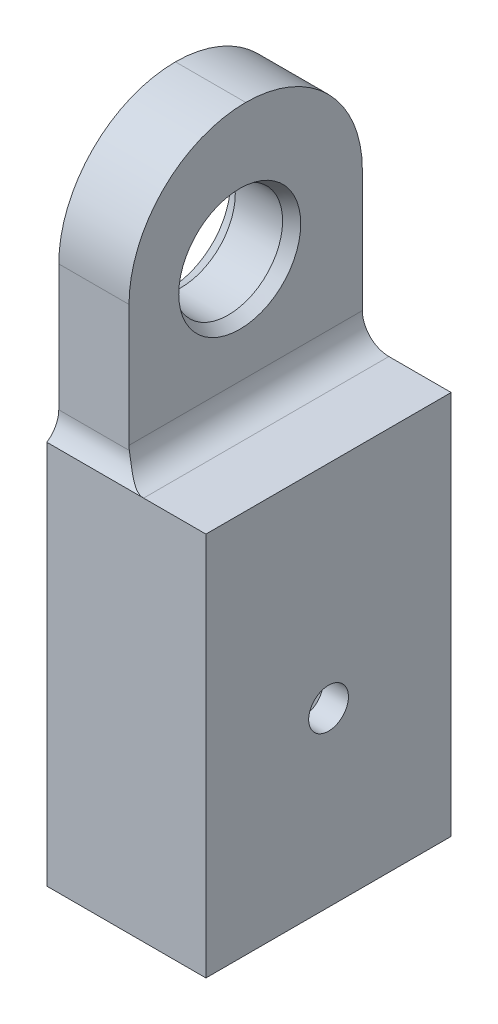
ISO-10303-21;
HEADER;
FILE_DESCRIPTION(('STEP AP214'),'2;1');
FILE_NAME('part.step','',(''),(''),'','','');
FILE_SCHEMA(('AUTOMOTIVE_DESIGN { 1 0 10303 214 1 1 1 1 }'));
ENDSEC;
DATA;
#1=APPLICATION_CONTEXT('core data for automotive mechanical design processes');
#2=APPLICATION_PROTOCOL_DEFINITION('international standard','automotive_design',2000,#1);
#3=PRODUCT_CONTEXT('',#1,'mechanical');
#4=PRODUCT('Part','Part','',(#3));
#5=PRODUCT_RELATED_PRODUCT_CATEGORY('part','',(#4));
#6=PRODUCT_DEFINITION_FORMATION('','',#4);
#7=PRODUCT_DEFINITION_CONTEXT('part definition',#1,'design');
#8=PRODUCT_DEFINITION('design','',#6,#7);
#9=PRODUCT_DEFINITION_SHAPE('','',#8);
#10=(LENGTH_UNIT() NAMED_UNIT(*) SI_UNIT(.MILLI.,.METRE.));
#11=(NAMED_UNIT(*) PLANE_ANGLE_UNIT() SI_UNIT($,.RADIAN.));
#12=(NAMED_UNIT(*) SI_UNIT($,.STERADIAN.) SOLID_ANGLE_UNIT());
#13=UNCERTAINTY_MEASURE_WITH_UNIT(LENGTH_MEASURE(1.E-05),#10,'distance_accuracy_value','');
#14=(GEOMETRIC_REPRESENTATION_CONTEXT(3) GLOBAL_UNCERTAINTY_ASSIGNED_CONTEXT((#13)) GLOBAL_UNIT_ASSIGNED_CONTEXT((#10,
#11,#12)) REPRESENTATION_CONTEXT('',''));
#15=CARTESIAN_POINT('',(0.,0.,0.));
#16=DIRECTION('',(0.,0.,1.));
#17=DIRECTION('',(1.,0.,0.));
#18=AXIS2_PLACEMENT_3D('',#15,#16,#17);
#19=CARTESIAN_POINT('',(0.,29.,0.));
#20=DIRECTION('',(0.,-1.,0.));
#21=DIRECTION('',(0.,0.,-1.));
#22=AXIS2_PLACEMENT_3D('',#19,#20,#21);
#23=PLANE('',#22);
#24=DIRECTION('',(-1.,0.,0.));
#25=VECTOR('',#24,1.);
#26=CARTESIAN_POINT('',(-6.,29.,-9.25));
#27=LINE('',#26,#25);
#28=CARTESIAN_POINT('',(6.,29.,-9.25));
#29=VERTEX_POINT('',#28);
#30=CARTESIAN_POINT('',(1.3,29.,-9.25));
#31=VERTEX_POINT('',#30);
#32=EDGE_CURVE('E189',#29,#31,#27,.T.);
#33=ORIENTED_EDGE('',*,*,#32,.T.);
#34=DIRECTION('',(0.,0.,-1.));
#35=VECTOR('',#34,1.);
#36=CARTESIAN_POINT('',(1.3,29.,8.35));
#37=LINE('',#36,#35);
#38=CARTESIAN_POINT('',(1.3,29.,9.25));
#39=VERTEX_POINT('',#38);
#40=EDGE_CURVE('E253',#31,#39,#37,.F.);
#41=ORIENTED_EDGE('',*,*,#40,.T.);
#42=DIRECTION('',(1.,0.,0.));
#43=VECTOR('',#42,1.);
#44=CARTESIAN_POINT('',(-6.,29.,9.25));
#45=LINE('',#44,#43);
#46=CARTESIAN_POINT('',(6.,29.,9.25));
#47=VERTEX_POINT('',#46);
#48=EDGE_CURVE('E193',#39,#47,#45,.T.);
#49=ORIENTED_EDGE('',*,*,#48,.T.);
#50=DIRECTION('',(0.,0.,-1.));
#51=VECTOR('',#50,1.);
#52=CARTESIAN_POINT('',(6.,29.,9.25));
#53=LINE('',#52,#51);
#54=EDGE_CURVE('E186',#47,#29,#53,.T.);
#55=ORIENTED_EDGE('',*,*,#54,.T.);
#56=EDGE_LOOP('',(#33,#41,#49,#55));
#57=FACE_BOUND('',#56,.T.);
#58=ADVANCED_FACE('F35',(#57),#23,.F.);
#59=CARTESIAN_POINT('',(6.,29.,9.25));
#60=DIRECTION('',(-1.,0.,0.));
#61=DIRECTION('',(0.,0.,1.));
#62=AXIS2_PLACEMENT_3D('',#59,#60,#61);
#63=PLANE('',#62);
#64=CARTESIAN_POINT('',(6.,13.,0.));
#65=DIRECTION('',(1.,0.,0.));
#66=DIRECTION('',(0.,0.,-1.));
#67=AXIS2_PLACEMENT_3D('',#64,#65,#66);
#68=CIRCLE('',#67,1.5);
#69=CARTESIAN_POINT('',(6.,13.,-1.5));
#70=VERTEX_POINT('',#69);
#71=EDGE_CURVE('E361',#70,#70,#68,.T.);
#72=ORIENTED_EDGE('',*,*,#71,.F.);
#73=EDGE_LOOP('',(#72));
#74=FACE_BOUND('',#73,.T.);
#75=DIRECTION('',(0.,0.,-1.));
#76=VECTOR('',#75,1.);
#77=CARTESIAN_POINT('',(6.,0.,9.25));
#78=LINE('',#77,#76);
#79=CARTESIAN_POINT('',(6.,0.,9.25));
#80=VERTEX_POINT('',#79);
#81=CARTESIAN_POINT('',(6.,0.,-9.25));
#82=VERTEX_POINT('',#81);
#83=EDGE_CURVE('E182',#80,#82,#78,.T.);
#84=ORIENTED_EDGE('',*,*,#83,.T.);
#85=DIRECTION('',(0.,-1.,0.));
#86=VECTOR('',#85,1.);
#87=CARTESIAN_POINT('',(6.,29.,-9.25));
#88=LINE('',#87,#86);
#89=EDGE_CURVE('E213',#29,#82,#88,.T.);
#90=ORIENTED_EDGE('',*,*,#89,.F.);
#91=ORIENTED_EDGE('',*,*,#54,.F.);
#92=DIRECTION('',(0.,-1.,0.));
#93=VECTOR('',#92,1.);
#94=CARTESIAN_POINT('',(6.,29.,9.25));
#95=LINE('',#94,#93);
#96=EDGE_CURVE('E197',#47,#80,#95,.T.);
#97=ORIENTED_EDGE('',*,*,#96,.T.);
#98=EDGE_LOOP('',(#84,#90,#91,#97));
#99=FACE_BOUND('',#98,.T.);
#100=ADVANCED_FACE('F297',(#74,#99),#63,.F.);
#101=CARTESIAN_POINT('',(-6.,29.,-9.25));
#102=DIRECTION('',(0.,0.,1.));
#103=DIRECTION('',(1.,0.,0.));
#104=AXIS2_PLACEMENT_3D('',#101,#102,#103);
#105=PLANE('',#104);
#106=DIRECTION('',(0.,-1.,0.));
#107=VECTOR('',#106,1.);
#108=CARTESIAN_POINT('',(-6.,29.,-9.25));
#109=LINE('',#108,#107);
#110=CARTESIAN_POINT('',(-6.,40.2,-9.25));
#111=VERTEX_POINT('',#110);
#112=CARTESIAN_POINT('',(-6.,0.,-9.25));
#113=VERTEX_POINT('',#112);
#114=EDGE_CURVE('E211',#111,#113,#109,.T.);
#115=ORIENTED_EDGE('',*,*,#114,.F.);
#116=DIRECTION('',(-1.,0.,0.));
#117=VECTOR('',#116,1.);
#118=CARTESIAN_POINT('',(-6.,40.2,-9.25));
#119=LINE('',#118,#117);
#120=CARTESIAN_POINT('',(-0.699999999999998,40.2,-9.25));
#121=VERTEX_POINT('',#120);
#122=EDGE_CURVE('E220',#111,#121,#119,.F.);
#123=ORIENTED_EDGE('',*,*,#122,.T.);
#124=DIRECTION('',(0.,-1.,0.));
#125=VECTOR('',#124,1.);
#126=CARTESIAN_POINT('',(-0.699999999999998,49.,-9.25));
#127=LINE('',#126,#125);
#128=CARTESIAN_POINT('',(-0.699999999999998,31.,-9.25));
#129=VERTEX_POINT('',#128);
#130=EDGE_CURVE('E170',#121,#129,#127,.T.);
#131=ORIENTED_EDGE('',*,*,#130,.T.);
#132=CARTESIAN_POINT('',(1.3,31.,-9.25));
#133=DIRECTION('',(0.,0.,1.));
#134=DIRECTION('',(1.,0.,0.));
#135=AXIS2_PLACEMENT_3D('',#132,#133,#134);
#136=CIRCLE('',#135,2.);
#137=EDGE_CURVE('E257',#129,#31,#136,.T.);
#138=ORIENTED_EDGE('',*,*,#137,.T.);
#139=ORIENTED_EDGE('',*,*,#32,.F.);
#140=ORIENTED_EDGE('',*,*,#89,.T.);
#141=DIRECTION('',(-1.,0.,0.));
#142=VECTOR('',#141,1.);
#143=CARTESIAN_POINT('',(-6.,0.,-9.25));
#144=LINE('',#143,#142);
#145=EDGE_CURVE('E200',#82,#113,#144,.T.);
#146=ORIENTED_EDGE('',*,*,#145,.T.);
#147=EDGE_LOOP('',(#115,#123,#131,#138,#139,#140,#146));
#148=FACE_BOUND('',#147,.T.);
#149=ADVANCED_FACE('F309',(#148),#105,.F.);
#150=CARTESIAN_POINT('',(-6.,29.,9.25));
#151=DIRECTION('',(1.,0.,0.));
#152=DIRECTION('',(0.,0.,-1.));
#153=AXIS2_PLACEMENT_3D('',#150,#151,#152);
#154=PLANE('',#153);
#155=CARTESIAN_POINT('',(-6.,39.,0.));
#156=DIRECTION('',(1.,0.,0.));
#157=DIRECTION('',(0.,0.,-1.));
#158=AXIS2_PLACEMENT_3D('',#155,#156,#157);
#159=CIRCLE('',#158,4.60000000000004);
#160=CARTESIAN_POINT('',(-6.,39.,-4.60000000000004));
#161=VERTEX_POINT('',#160);
#162=EDGE_CURVE('E244',#161,#161,#159,.T.);
#163=ORIENTED_EDGE('',*,*,#162,.T.);
#164=EDGE_LOOP('',(#163));
#165=FACE_BOUND('',#164,.T.);
#166=CARTESIAN_POINT('',(-6.,13.,0.));
#167=DIRECTION('',(1.,0.,0.));
#168=DIRECTION('',(0.,0.,-1.));
#169=AXIS2_PLACEMENT_3D('',#166,#167,#168);
#170=CIRCLE('',#169,1.5);
#171=CARTESIAN_POINT('',(-6.,13.,-1.5));
#172=VERTEX_POINT('',#171);
#173=EDGE_CURVE('E238',#172,#172,#170,.T.);
#174=ORIENTED_EDGE('',*,*,#173,.T.);
#175=EDGE_LOOP('',(#174));
#176=FACE_BOUND('',#175,.T.);
#177=CARTESIAN_POINT('',(-6.,40.2,-0.449999999999999));
#178=DIRECTION('',(1.,0.,0.));
#179=DIRECTION('',(0.,0.,-1.));
#180=AXIS2_PLACEMENT_3D('',#177,#178,#179);
#181=CIRCLE('',#180,8.8);
#182=CARTESIAN_POINT('',(-6.,40.2,8.35));
#183=VERTEX_POINT('',#182);
#184=CARTESIAN_POINT('',(-6.,49.,-0.449999999999999));
#185=VERTEX_POINT('',#184);
#186=EDGE_CURVE('E216',#183,#185,#181,.F.);
#187=ORIENTED_EDGE('',*,*,#186,.T.);
#188=CARTESIAN_POINT('',(-6.,40.2,-0.450000000000001));
#189=DIRECTION('',(1.,0.,0.));
#190=DIRECTION('',(0.,0.,-1.));
#191=AXIS2_PLACEMENT_3D('',#188,#189,#190);
#192=CIRCLE('',#191,8.8);
#193=EDGE_CURVE('E218',#185,#111,#192,.F.);
#194=ORIENTED_EDGE('',*,*,#193,.T.);
#195=ORIENTED_EDGE('',*,*,#114,.T.);
#196=DIRECTION('',(0.,0.,1.));
#197=VECTOR('',#196,1.);
#198=CARTESIAN_POINT('',(-6.,0.,9.25));
#199=LINE('',#198,#197);
#200=CARTESIAN_POINT('',(-6.,0.,9.25));
#201=VERTEX_POINT('',#200);
#202=EDGE_CURVE('E203',#113,#201,#199,.T.);
#203=ORIENTED_EDGE('',*,*,#202,.T.);
#204=DIRECTION('',(0.,-1.,0.));
#205=VECTOR('',#204,1.);
#206=CARTESIAN_POINT('',(-6.,29.,9.25));
#207=LINE('',#206,#205);
#208=CARTESIAN_POINT('',(-6.,29.,9.25));
#209=VERTEX_POINT('',#208);
#210=EDGE_CURVE('E208',#209,#201,#207,.T.);
#211=ORIENTED_EDGE('',*,*,#210,.F.);
#212=CARTESIAN_POINT('',(-6.,30.670329308849,10.35));
#213=DIRECTION('',(1.,0.,0.));
#214=DIRECTION('',(0.,0.,-1.));
#215=AXIS2_PLACEMENT_3D('',#212,#213,#214);
#216=CIRCLE('',#215,2.);
#217=CARTESIAN_POINT('',(-6.,30.670329308849,8.35));
#218=VERTEX_POINT('',#217);
#219=EDGE_CURVE('E11',#209,#218,#216,.T.);
#220=ORIENTED_EDGE('',*,*,#219,.T.);
#221=DIRECTION('',(0.,-1.,0.));
#222=VECTOR('',#221,1.);
#223=CARTESIAN_POINT('',(-6.,49.,8.35));
#224=LINE('',#223,#222);
#225=EDGE_CURVE('E351',#183,#218,#224,.T.);
#226=ORIENTED_EDGE('',*,*,#225,.F.);
#227=EDGE_LOOP('',(#187,#194,#195,#203,#211,#220,#226));
#228=FACE_BOUND('',#227,.T.);
#229=ADVANCED_FACE('F305',(#165,#176,#228),#154,.F.);
#230=CARTESIAN_POINT('',(-6.,29.,9.25));
#231=DIRECTION('',(0.,0.,-1.));
#232=DIRECTION('',(-1.,0.,0.));
#233=AXIS2_PLACEMENT_3D('',#230,#231,#232);
#234=PLANE('',#233);
#235=DIRECTION('',(1.,0.,0.));
#236=VECTOR('',#235,1.);
#237=CARTESIAN_POINT('',(-6.,0.,9.25));
#238=LINE('',#237,#236);
#239=EDGE_CURVE('E190',#201,#80,#238,.T.);
#240=ORIENTED_EDGE('',*,*,#239,.T.);
#241=ORIENTED_EDGE('',*,*,#96,.F.);
#242=ORIENTED_EDGE('',*,*,#48,.F.);
#243=EDGE_CURVE('E194',#209,#39,#45,.T.);
#244=ORIENTED_EDGE('',*,*,#243,.F.);
#245=ORIENTED_EDGE('',*,*,#210,.T.);
#246=EDGE_LOOP('',(#240,#241,#242,#244,#245));
#247=FACE_BOUND('',#246,.T.);
#248=ADVANCED_FACE('F301',(#247),#234,.F.);
#249=CARTESIAN_POINT('',(0.,0.,0.));
#250=DIRECTION('',(0.,-1.,0.));
#251=DIRECTION('',(0.,0.,-1.));
#252=AXIS2_PLACEMENT_3D('',#249,#250,#251);
#253=PLANE('',#252);
#254=DIRECTION('',(0.,0.,1.));
#255=VECTOR('',#254,1.);
#256=CARTESIAN_POINT('',(4.1,0.,-7.6));
#257=LINE('',#256,#255);
#258=CARTESIAN_POINT('',(4.1,0.,-7.6));
#259=VERTEX_POINT('',#258);
#260=CARTESIAN_POINT('',(4.1,0.,7.6));
#261=VERTEX_POINT('',#260);
#262=EDGE_CURVE('E147',#259,#261,#257,.T.);
#263=ORIENTED_EDGE('',*,*,#262,.F.);
#264=DIRECTION('',(1.,0.,0.));
#265=VECTOR('',#264,1.);
#266=CARTESIAN_POINT('',(-4.1,0.,-7.6));
#267=LINE('',#266,#265);
#268=CARTESIAN_POINT('',(-4.1,0.,-7.6));
#269=VERTEX_POINT('',#268);
#270=EDGE_CURVE('E164',#269,#259,#267,.T.);
#271=ORIENTED_EDGE('',*,*,#270,.F.);
#272=DIRECTION('',(0.,0.,-1.));
#273=VECTOR('',#272,1.);
#274=CARTESIAN_POINT('',(-4.1,0.,-7.6));
#275=LINE('',#274,#273);
#276=CARTESIAN_POINT('',(-4.1,0.,7.6));
#277=VERTEX_POINT('',#276);
#278=EDGE_CURVE('E167',#277,#269,#275,.T.);
#279=ORIENTED_EDGE('',*,*,#278,.F.);
#280=DIRECTION('',(-1.,0.,0.));
#281=VECTOR('',#280,1.);
#282=CARTESIAN_POINT('',(-4.1,0.,7.6));
#283=LINE('',#282,#281);
#284=EDGE_CURVE('E176',#261,#277,#283,.T.);
#285=ORIENTED_EDGE('',*,*,#284,.F.);
#286=EDGE_LOOP('',(#263,#271,#279,#285));
#287=FACE_BOUND('',#286,.T.);
#288=ORIENTED_EDGE('',*,*,#83,.F.);
#289=ORIENTED_EDGE('',*,*,#239,.F.);
#290=ORIENTED_EDGE('',*,*,#202,.F.);
#291=ORIENTED_EDGE('',*,*,#145,.F.);
#292=EDGE_LOOP('',(#288,#289,#290,#291));
#293=FACE_BOUND('',#292,.T.);
#294=ADVANCED_FACE('F293',(#287,#293),#253,.T.);
#295=CARTESIAN_POINT('',(4.1,23.,-7.6));
#296=DIRECTION('',(1.,0.,0.));
#297=DIRECTION('',(0.,0.,-1.));
#298=AXIS2_PLACEMENT_3D('',#295,#296,#297);
#299=PLANE('',#298);
#300=CARTESIAN_POINT('',(4.1,13.,0.));
#301=DIRECTION('',(1.,0.,0.));
#302=DIRECTION('',(0.,0.,-1.));
#303=AXIS2_PLACEMENT_3D('',#300,#301,#302);
#304=CIRCLE('',#303,1.5);
#305=CARTESIAN_POINT('',(4.1,13.,-1.5));
#306=VERTEX_POINT('',#305);
#307=EDGE_CURVE('E234',#306,#306,#304,.T.);
#308=ORIENTED_EDGE('',*,*,#307,.T.);
#309=EDGE_LOOP('',(#308));
#310=FACE_BOUND('',#309,.T.);
#311=ORIENTED_EDGE('',*,*,#262,.T.);
#312=DIRECTION('',(0.,-1.,0.));
#313=VECTOR('',#312,1.);
#314=CARTESIAN_POINT('',(4.1,23.,7.6));
#315=LINE('',#314,#313);
#316=CARTESIAN_POINT('',(4.1,23.,7.6));
#317=VERTEX_POINT('',#316);
#318=EDGE_CURVE('E140',#317,#261,#315,.T.);
#319=ORIENTED_EDGE('',*,*,#318,.F.);
#320=DIRECTION('',(0.,0.,1.));
#321=VECTOR('',#320,1.);
#322=CARTESIAN_POINT('',(4.1,23.,-7.6));
#323=LINE('',#322,#321);
#324=CARTESIAN_POINT('',(4.1,23.,-7.6));
#325=VERTEX_POINT('',#324);
#326=EDGE_CURVE('E144',#325,#317,#323,.T.);
#327=ORIENTED_EDGE('',*,*,#326,.F.);
#328=DIRECTION('',(0.,-1.,0.));
#329=VECTOR('',#328,1.);
#330=CARTESIAN_POINT('',(4.1,23.,-7.6));
#331=LINE('',#330,#329);
#332=EDGE_CURVE('E180',#325,#259,#331,.T.);
#333=ORIENTED_EDGE('',*,*,#332,.T.);
#334=EDGE_LOOP('',(#311,#319,#327,#333));
#335=FACE_BOUND('',#334,.T.);
#336=ADVANCED_FACE('F142',(#310,#335),#299,.F.);
#337=CARTESIAN_POINT('',(-4.1,23.,-7.6));
#338=DIRECTION('',(0.,0.,-1.));
#339=DIRECTION('',(-1.,0.,0.));
#340=AXIS2_PLACEMENT_3D('',#337,#338,#339);
#341=PLANE('',#340);
#342=ORIENTED_EDGE('',*,*,#270,.T.);
#343=ORIENTED_EDGE('',*,*,#332,.F.);
#344=DIRECTION('',(1.,0.,0.));
#345=VECTOR('',#344,1.);
#346=CARTESIAN_POINT('',(-4.1,23.,-7.6));
#347=LINE('',#346,#345);
#348=CARTESIAN_POINT('',(-4.1,23.,-7.6));
#349=VERTEX_POINT('',#348);
#350=EDGE_CURVE('E152',#349,#325,#347,.T.);
#351=ORIENTED_EDGE('',*,*,#350,.F.);
#352=DIRECTION('',(0.,-1.,0.));
#353=VECTOR('',#352,1.);
#354=CARTESIAN_POINT('',(-4.1,23.,-7.6));
#355=LINE('',#354,#353);
#356=EDGE_CURVE('E183',#349,#269,#355,.T.);
#357=ORIENTED_EDGE('',*,*,#356,.T.);
#358=EDGE_LOOP('',(#342,#343,#351,#357));
#359=FACE_BOUND('',#358,.T.);
#360=ADVANCED_FACE('F281',(#359),#341,.F.);
#361=CARTESIAN_POINT('',(-4.1,23.,-7.6));
#362=DIRECTION('',(-1.,0.,0.));
#363=DIRECTION('',(0.,0.,1.));
#364=AXIS2_PLACEMENT_3D('',#361,#362,#363);
#365=PLANE('',#364);
#366=CARTESIAN_POINT('',(-4.1,13.,0.));
#367=DIRECTION('',(-1.,0.,0.));
#368=DIRECTION('',(0.,0.,1.));
#369=AXIS2_PLACEMENT_3D('',#366,#367,#368);
#370=CIRCLE('',#369,1.5);
#371=CARTESIAN_POINT('',(-4.1,13.,1.5));
#372=VERTEX_POINT('',#371);
#373=EDGE_CURVE('E235',#372,#372,#370,.T.);
#374=ORIENTED_EDGE('',*,*,#373,.T.);
#375=EDGE_LOOP('',(#374));
#376=FACE_BOUND('',#375,.T.);
#377=ORIENTED_EDGE('',*,*,#278,.T.);
#378=ORIENTED_EDGE('',*,*,#356,.F.);
#379=DIRECTION('',(0.,0.,-1.));
#380=VECTOR('',#379,1.);
#381=CARTESIAN_POINT('',(-4.1,23.,-7.6));
#382=LINE('',#381,#380);
#383=CARTESIAN_POINT('',(-4.1,23.,7.6));
#384=VERTEX_POINT('',#383);
#385=EDGE_CURVE('E160',#384,#349,#382,.T.);
#386=ORIENTED_EDGE('',*,*,#385,.F.);
#387=DIRECTION('',(0.,-1.,0.));
#388=VECTOR('',#387,1.);
#389=CARTESIAN_POINT('',(-4.1,23.,7.6));
#390=LINE('',#389,#388);
#391=EDGE_CURVE('E151',#384,#277,#390,.T.);
#392=ORIENTED_EDGE('',*,*,#391,.T.);
#393=EDGE_LOOP('',(#377,#378,#386,#392));
#394=FACE_BOUND('',#393,.T.);
#395=ADVANCED_FACE('F284',(#376,#394),#365,.F.);
#396=CARTESIAN_POINT('',(-4.1,23.,7.6));
#397=DIRECTION('',(0.,0.,1.));
#398=DIRECTION('',(1.,0.,0.));
#399=AXIS2_PLACEMENT_3D('',#396,#397,#398);
#400=PLANE('',#399);
#401=ORIENTED_EDGE('',*,*,#284,.T.);
#402=ORIENTED_EDGE('',*,*,#391,.F.);
#403=DIRECTION('',(-1.,0.,0.));
#404=VECTOR('',#403,1.);
#405=CARTESIAN_POINT('',(-4.1,23.,7.6));
#406=LINE('',#405,#404);
#407=EDGE_CURVE('E155',#317,#384,#406,.T.);
#408=ORIENTED_EDGE('',*,*,#407,.F.);
#409=ORIENTED_EDGE('',*,*,#318,.T.);
#410=EDGE_LOOP('',(#401,#402,#408,#409));
#411=FACE_BOUND('',#410,.T.);
#412=ADVANCED_FACE('F156',(#411),#400,.F.);
#413=CARTESIAN_POINT('',(0.,23.,0.));
#414=DIRECTION('',(0.,1.,0.));
#415=DIRECTION('',(0.,0.,1.));
#416=AXIS2_PLACEMENT_3D('',#413,#414,#415);
#417=PLANE('',#416);
#418=ORIENTED_EDGE('',*,*,#326,.T.);
#419=ORIENTED_EDGE('',*,*,#407,.T.);
#420=ORIENTED_EDGE('',*,*,#385,.T.);
#421=ORIENTED_EDGE('',*,*,#350,.T.);
#422=EDGE_LOOP('',(#418,#419,#420,#421));
#423=FACE_BOUND('',#422,.T.);
#424=ADVANCED_FACE('F162',(#423),#417,.F.);
#425=CARTESIAN_POINT('',(-0.699999999999998,49.,8.35));
#426=DIRECTION('',(-1.,0.,0.));
#427=DIRECTION('',(0.,0.,1.));
#428=AXIS2_PLACEMENT_3D('',#425,#426,#427);
#429=PLANE('',#428);
#430=CARTESIAN_POINT('',(-0.699999999999998,39.,0.));
#431=DIRECTION('',(-1.,0.,0.));
#432=DIRECTION('',(0.,0.,1.));
#433=AXIS2_PLACEMENT_3D('',#430,#431,#432);
#434=CIRCLE('',#433,4.60000000000005);
#435=CARTESIAN_POINT('',(-0.699999999999998,39.,4.60000000000005));
#436=VERTEX_POINT('',#435);
#437=EDGE_CURVE('E247',#436,#436,#434,.T.);
#438=ORIENTED_EDGE('',*,*,#437,.T.);
#439=EDGE_LOOP('',(#438));
#440=FACE_BOUND('',#439,.T.);
#441=DIRECTION('',(0.,-1.,0.));
#442=VECTOR('',#441,1.);
#443=CARTESIAN_POINT('',(-0.699999999999998,49.,8.35));
#444=LINE('',#443,#442);
#445=CARTESIAN_POINT('',(-0.699999999999998,40.2,8.35));
#446=VERTEX_POINT('',#445);
#447=CARTESIAN_POINT('',(-0.699999999999998,31.,8.35));
#448=VERTEX_POINT('',#447);
#449=EDGE_CURVE('E233',#446,#448,#444,.T.);
#450=ORIENTED_EDGE('',*,*,#449,.T.);
#451=DIRECTION('',(0.,0.,-1.));
#452=VECTOR('',#451,1.);
#453=CARTESIAN_POINT('',(-0.699999999999998,31.,-9.25));
#454=LINE('',#453,#452);
#455=EDGE_CURVE('E250',#448,#129,#454,.T.);
#456=ORIENTED_EDGE('',*,*,#455,.T.);
#457=ORIENTED_EDGE('',*,*,#130,.F.);
#458=CARTESIAN_POINT('',(-0.699999999999998,40.2,-0.450000000000001));
#459=DIRECTION('',(-1.,0.,0.));
#460=DIRECTION('',(0.,0.,1.));
#461=AXIS2_PLACEMENT_3D('',#458,#459,#460);
#462=CIRCLE('',#461,8.8);
#463=CARTESIAN_POINT('',(-0.699999999999998,49.,-0.449999999999999));
#464=VERTEX_POINT('',#463);
#465=EDGE_CURVE('E225',#121,#464,#462,.F.);
#466=ORIENTED_EDGE('',*,*,#465,.T.);
#467=CARTESIAN_POINT('',(-0.699999999999998,40.2,-0.449999999999999));
#468=DIRECTION('',(-1.,0.,0.));
#469=DIRECTION('',(0.,0.,1.));
#470=AXIS2_PLACEMENT_3D('',#467,#468,#469);
#471=CIRCLE('',#470,8.8);
#472=EDGE_CURVE('E223',#464,#446,#471,.F.);
#473=ORIENTED_EDGE('',*,*,#472,.T.);
#474=EDGE_LOOP('',(#450,#456,#457,#466,#473));
#475=FACE_BOUND('',#474,.T.);
#476=ADVANCED_FACE('F274',(#440,#475),#429,.F.);
#477=CARTESIAN_POINT('',(-6.,49.,8.35));
#478=DIRECTION('',(0.,0.,-1.));
#479=DIRECTION('',(-1.,0.,0.));
#480=AXIS2_PLACEMENT_3D('',#477,#478,#479);
#481=PLANE('',#480);
#482=ORIENTED_EDGE('',*,*,#225,.T.);
#483=DIRECTION('',(1.,0.,0.));
#484=VECTOR('',#483,1.);
#485=CARTESIAN_POINT('',(-6.,30.670329308849,8.35));
#486=LINE('',#485,#484);
#487=CARTESIAN_POINT('',(-0.699999999999998,30.670329308849,8.35));
#488=VERTEX_POINT('',#487);
#489=EDGE_CURVE('E255',#218,#488,#486,.T.);
#490=ORIENTED_EDGE('',*,*,#489,.T.);
#491=CARTESIAN_POINT('',(-0.699999999999998,30.670329308849,8.35));
#492=CARTESIAN_POINT('',(-0.672642196495861,30.670329308849,8.35));
#493=B_SPLINE_CURVE_WITH_KNOTS('',1,(#491,#492),.UNSPECIFIED.,.F.,.F.,(2,2),(0.,1.),.UNSPECIFIED.);
#494=CARTESIAN_POINT('',(-0.672642196495861,30.670329308849,8.35));
#495=VERTEX_POINT('',#494);
#496=EDGE_CURVE('E49',#488,#495,#493,.T.);
#497=ORIENTED_EDGE('',*,*,#496,.T.);
#498=CARTESIAN_POINT('',(1.3,31.,8.35));
#499=DIRECTION('',(0.,0.,-1.));
#500=DIRECTION('',(-1.,0.,0.));
#501=AXIS2_PLACEMENT_3D('',#498,#499,#500);
#502=CIRCLE('',#501,2.);
#503=EDGE_CURVE('E259',#495,#448,#502,.T.);
#504=ORIENTED_EDGE('',*,*,#503,.T.);
#505=ORIENTED_EDGE('',*,*,#449,.F.);
#506=DIRECTION('',(1.,0.,0.));
#507=VECTOR('',#506,1.);
#508=CARTESIAN_POINT('',(-6.,40.2,8.35));
#509=LINE('',#508,#507);
#510=EDGE_CURVE('E227',#446,#183,#509,.F.);
#511=ORIENTED_EDGE('',*,*,#510,.T.);
#512=EDGE_LOOP('',(#482,#490,#497,#504,#505,#511));
#513=FACE_BOUND('',#512,.T.);
#514=ADVANCED_FACE('F263',(#513),#481,.F.);
#515=CARTESIAN_POINT('',(-6.001,39.,0.));
#516=DIRECTION('',(1.,0.,0.));
#517=DIRECTION('',(0.,0.,-1.));
#518=AXIS2_PLACEMENT_3D('',#515,#516,#517);
#519=CYLINDRICAL_SURFACE('',#518,4.1);
#520=CARTESIAN_POINT('',(-5.1339745962155,39.,0.));
#521=DIRECTION('',(1.,0.,0.));
#522=DIRECTION('',(0.,0.,-1.));
#523=AXIS2_PLACEMENT_3D('',#520,#521,#522);
#524=CIRCLE('',#523,4.1);
#525=CARTESIAN_POINT('',(-5.1339745962155,39.,-4.1));
#526=VERTEX_POINT('',#525);
#527=EDGE_CURVE('E241',#526,#526,#524,.F.);
#528=CARTESIAN_POINT('',(-1.56602540378452,39.,0.));
#529=DIRECTION('',(-1.,0.,0.));
#530=DIRECTION('',(0.,0.,1.));
#531=AXIS2_PLACEMENT_3D('',#528,#529,#530);
#532=CIRCLE('',#531,4.1);
#533=CARTESIAN_POINT('',(-1.56602540378452,39.,-4.1));
#534=VERTEX_POINT('',#533);
#535=EDGE_CURVE('E229',#534,#534,#532,.F.);
#536=CARTESIAN_POINT('',(-5.1339745962155,39.,-4.1));
#537=CARTESIAN_POINT('',(-5.09680845879435,39.,-4.1));
#538=CARTESIAN_POINT('',(-5.05964232137319,39.,-4.1));
#539=CARTESIAN_POINT('',(-4.98531004653088,39.,-4.1));
#540=CARTESIAN_POINT('',(-4.94814390910972,39.,-4.1));
#541=CARTESIAN_POINT('',(-4.87381163426741,39.,-4.1));
#542=CARTESIAN_POINT('',(-4.83664549684625,39.,-4.1));
#543=CARTESIAN_POINT('',(-4.76231322200394,39.,-4.1));
#544=CARTESIAN_POINT('',(-4.72514708458279,39.,-4.1));
#545=CARTESIAN_POINT('',(-4.65081480974047,39.,-4.1));
#546=CARTESIAN_POINT('',(-4.61364867231932,39.,-4.1));
#547=CARTESIAN_POINT('',(-4.53931639747701,39.,-4.1));
#548=CARTESIAN_POINT('',(-4.50215026005585,39.,-4.1));
#549=CARTESIAN_POINT('',(-4.42781798521354,39.,-4.1));
#550=CARTESIAN_POINT('',(-4.39065184779238,39.,-4.1));
#551=CARTESIAN_POINT('',(-4.31631957295007,39.,-4.1));
#552=CARTESIAN_POINT('',(-4.27915343552891,39.,-4.1));
#553=CARTESIAN_POINT('',(-4.2048211606866,39.,-4.1));
#554=CARTESIAN_POINT('',(-4.16765502326545,39.,-4.1));
#555=CARTESIAN_POINT('',(-4.09332274842313,39.,-4.1));
#556=CARTESIAN_POINT('',(-4.05615661100198,39.,-4.1));
#557=CARTESIAN_POINT('',(-3.98182433615966,39.,-4.1));
#558=CARTESIAN_POINT('',(-3.94465819873851,39.,-4.1));
#559=CARTESIAN_POINT('',(-3.8703259238962,39.,-4.1));
#560=CARTESIAN_POINT('',(-3.83315978647504,39.,-4.1));
#561=CARTESIAN_POINT('',(-3.75882751163273,39.,-4.1));
#562=CARTESIAN_POINT('',(-3.72166137421157,39.,-4.1));
#563=CARTESIAN_POINT('',(-3.64732909936926,39.,-4.1));
#564=CARTESIAN_POINT('',(-3.6101629619481,39.,-4.1));
#565=CARTESIAN_POINT('',(-3.53583068710579,39.,-4.1));
#566=CARTESIAN_POINT('',(-3.49866454968464,39.,-4.1));
#567=CARTESIAN_POINT('',(-3.42433227484232,39.,-4.1));
#568=CARTESIAN_POINT('',(-3.38716613742117,39.,-4.1));
#569=CARTESIAN_POINT('',(-3.31283386257886,39.,-4.1));
#570=CARTESIAN_POINT('',(-3.2756677251577,39.,-4.1));
#571=CARTESIAN_POINT('',(-3.20133545031539,39.,-4.1));
#572=CARTESIAN_POINT('',(-3.16416931289423,39.,-4.1));
#573=CARTESIAN_POINT('',(-3.08983703805192,39.,-4.1));
#574=CARTESIAN_POINT('',(-3.05267090063076,39.,-4.1));
#575=CARTESIAN_POINT('',(-2.97833862578845,39.,-4.1));
#576=CARTESIAN_POINT('',(-2.9411724883673,39.,-4.1));
#577=CARTESIAN_POINT('',(-2.86684021352498,39.,-4.1));
#578=CARTESIAN_POINT('',(-2.82967407610383,39.,-4.1));
#579=CARTESIAN_POINT('',(-2.75534180126151,39.,-4.1));
#580=CARTESIAN_POINT('',(-2.71817566384036,39.,-4.1));
#581=CARTESIAN_POINT('',(-2.64384338899805,39.,-4.1));
#582=CARTESIAN_POINT('',(-2.60667725157689,39.,-4.1));
#583=CARTESIAN_POINT('',(-2.53234497673458,39.,-4.1));
#584=CARTESIAN_POINT('',(-2.49517883931342,39.,-4.1));
#585=CARTESIAN_POINT('',(-2.42084656447111,39.,-4.1));
#586=CARTESIAN_POINT('',(-2.38368042704995,39.,-4.1));
#587=CARTESIAN_POINT('',(-2.30934815220764,39.,-4.1));
#588=CARTESIAN_POINT('',(-2.27218201478649,39.,-4.1));
#589=CARTESIAN_POINT('',(-2.19784973994417,39.,-4.1));
#590=CARTESIAN_POINT('',(-2.16068360252302,39.,-4.1));
#591=CARTESIAN_POINT('',(-2.08635132768071,39.,-4.1));
#592=CARTESIAN_POINT('',(-2.04918519025955,39.,-4.1));
#593=CARTESIAN_POINT('',(-1.97485291541724,39.,-4.1));
#594=CARTESIAN_POINT('',(-1.93768677799608,39.,-4.1));
#595=CARTESIAN_POINT('',(-1.86335450315377,39.,-4.1));
#596=CARTESIAN_POINT('',(-1.82618836573261,39.,-4.1));
#597=CARTESIAN_POINT('',(-1.7518560908903,39.,-4.1));
#598=CARTESIAN_POINT('',(-1.71468995346915,39.,-4.1));
#599=CARTESIAN_POINT('',(-1.64035767862683,39.,-4.1));
#600=CARTESIAN_POINT('',(-1.60319154120568,39.,-4.1));
#601=CARTESIAN_POINT('',(-1.56602540378452,39.,-4.1));
#602=B_SPLINE_CURVE_WITH_KNOTS('',3,(#536,#537,#538,#539,#540,#541,#542,#543,#544,#545,#546,
#547,#548,#549,#550,#551,#552,#553,#554,#555,#556,#557,#558,#559,#560,#561,#562,#563,#564,#565,
#566,#567,#568,#569,#570,#571,#572,#573,#574,#575,#576,#577,#578,#579,#580,#581,#582,#583,#584,
#585,#586,#587,#588,#589,#590,#591,#592,#593,#594,#595,#596,#597,#598,#599,#600,#601),
.UNSPECIFIED.,.F.,.F.,(4,2,2,2,2,2,2,2,2,2,2,2,2,2,2,2,2,2,2,2,2,2,2,2,2,2,2,2,2,2,2,2,4),(0.,
0.111498412263469,0.222996824526937,0.334495236790405,0.445993649053873,0.557492061317341,
0.66899047358081,0.780488885844277,0.891987298107745,1.00348571037121,1.11498412263468,
1.22648253489815,1.33798094716162,1.44947935942509,1.56097777168855,1.67247618395202,
1.78397459621549,1.89547300847896,2.00697142074243,2.1184698330059,2.22996824526936,
2.34146665753283,2.4529650697963,2.56446348205977,2.67596189432324,2.7874603065867,
2.89895871885017,3.01045713111364,3.12195554337711,3.23345395564058,3.34495236790404,
3.45645078016751,3.56794919243098),.UNSPECIFIED.);
#603=EDGE_CURVE('BSEAM273',#526,#534,#602,.T.);
#604=ORIENTED_EDGE('',*,*,#527,.T.);
#605=ORIENTED_EDGE('',*,*,#535,.T.);
#606=ORIENTED_EDGE('',*,*,#603,.T.);
#607=ORIENTED_EDGE('',*,*,#603,.F.);
#608=EDGE_LOOP('',(#604,#606,#605,#607));
#609=FACE_BOUND('',#608,.T.);
#610=ADVANCED_FACE('F273',(#609),#519,.F.);
#611=CARTESIAN_POINT('',(0.,40.2,-0.449999999999999));
#612=DIRECTION('',(1.,0.,0.));
#613=DIRECTION('',(0.,0.,-1.));
#614=AXIS2_PLACEMENT_3D('',#611,#612,#613);
#615=CYLINDRICAL_SURFACE('',#614,8.8);
#616=ORIENTED_EDGE('',*,*,#510,.F.);
#617=ORIENTED_EDGE('',*,*,#472,.F.);
#618=DIRECTION('',(1.,0.,0.));
#619=VECTOR('',#618,1.);
#620=CARTESIAN_POINT('',(0.,49.,-0.449999999999999));
#621=LINE('',#620,#619);
#622=EDGE_CURVE('E230',#185,#464,#621,.T.);
#623=ORIENTED_EDGE('',*,*,#622,.F.);
#624=ORIENTED_EDGE('',*,*,#186,.F.);
#625=EDGE_LOOP('',(#616,#617,#623,#624));
#626=FACE_BOUND('',#625,.T.);
#627=ADVANCED_FACE('F321',(#626),#615,.T.);
#628=CARTESIAN_POINT('',(0.,40.2,-0.450000000000001));
#629=DIRECTION('',(-1.,0.,0.));
#630=DIRECTION('',(0.,0.,1.));
#631=AXIS2_PLACEMENT_3D('',#628,#629,#630);
#632=CYLINDRICAL_SURFACE('',#631,8.8);
#633=ORIENTED_EDGE('',*,*,#465,.F.);
#634=ORIENTED_EDGE('',*,*,#122,.F.);
#635=ORIENTED_EDGE('',*,*,#193,.F.);
#636=ORIENTED_EDGE('',*,*,#622,.T.);
#637=EDGE_LOOP('',(#633,#634,#635,#636));
#638=FACE_BOUND('',#637,.T.);
#639=ADVANCED_FACE('F317',(#638),#632,.T.);
#640=CARTESIAN_POINT('',(-6.,13.,0.));
#641=DIRECTION('',(1.,0.,0.));
#642=DIRECTION('',(0.,0.,-1.));
#643=AXIS2_PLACEMENT_3D('',#640,#641,#642);
#644=CYLINDRICAL_SURFACE('',#643,1.5);
#645=ORIENTED_EDGE('',*,*,#173,.F.);
#646=EDGE_LOOP('',(#645));
#647=FACE_BOUND('',#646,.T.);
#648=ORIENTED_EDGE('',*,*,#373,.F.);
#649=EDGE_LOOP('',(#648));
#650=FACE_BOUND('',#649,.T.);
#651=ADVANCED_FACE('F320',(#647,#650),#644,.F.);
#652=ORIENTED_EDGE('',*,*,#71,.T.);
#653=EDGE_LOOP('',(#652));
#654=FACE_BOUND('',#653,.T.);
#655=ORIENTED_EDGE('',*,*,#307,.F.);
#656=EDGE_LOOP('',(#655));
#657=FACE_BOUND('',#656,.T.);
#658=ADVANCED_FACE('F334',(#654,#657),#644,.F.);
#659=CARTESIAN_POINT('',(-5.1339745962155,39.,0.));
#660=DIRECTION('',(-1.,0.,0.));
#661=DIRECTION('',(0.,0.,1.));
#662=AXIS2_PLACEMENT_3D('',#659,#660,#661);
#663=CONICAL_SURFACE('',#662,4.1,0.523598775598302);
#664=ORIENTED_EDGE('',*,*,#162,.F.);
#665=EDGE_LOOP('',(#664));
#666=FACE_BOUND('',#665,.T.);
#667=ORIENTED_EDGE('',*,*,#527,.F.);
#668=EDGE_LOOP('',(#667));
#669=FACE_BOUND('',#668,.T.);
#670=ADVANCED_FACE('F327',(#666,#669),#663,.F.);
#671=CARTESIAN_POINT('',(-1.56602540378452,39.,0.));
#672=DIRECTION('',(1.,0.,0.));
#673=DIRECTION('',(0.,0.,-1.));
#674=AXIS2_PLACEMENT_3D('',#671,#672,#673);
#675=CONICAL_SURFACE('',#674,4.1,0.523598775598301);
#676=ORIENTED_EDGE('',*,*,#437,.F.);
#677=EDGE_LOOP('',(#676));
#678=FACE_BOUND('',#677,.T.);
#679=ORIENTED_EDGE('',*,*,#535,.F.);
#680=EDGE_LOOP('',(#679));
#681=FACE_BOUND('',#680,.T.);
#682=ADVANCED_FACE('F333',(#678,#681),#675,.F.);
#683=CARTESIAN_POINT('',(0.,30.670329308849,10.35));
#684=DIRECTION('',(1.,0.,0.));
#685=DIRECTION('',(0.,0.,-1.));
#686=AXIS2_PLACEMENT_3D('',#683,#684,#685);
#687=CYLINDRICAL_SURFACE('',#686,2.);
#688=ORIENTED_EDGE('',*,*,#219,.F.);
#689=ORIENTED_EDGE('',*,*,#243,.T.);
#690=CARTESIAN_POINT('',(1.3,29.,9.25));
#691=CARTESIAN_POINT('',(1.26384942016274,28.9999933483743,9.25002455761846));
#692=CARTESIAN_POINT('',(1.22772567230282,29.0009805081888,9.24851021932982));
#693=CARTESIAN_POINT('',(1.15589209103377,29.0048764348967,9.24262179921915));
#694=CARTESIAN_POINT('',(1.1201815339661,29.0077810603738,9.23825388087965));
#695=CARTESIAN_POINT('',(1.01506312394536,29.0191611816568,9.22136002912026));
#696=CARTESIAN_POINT('',(0.946541782659302,29.0303075068688,9.205030356659));
#697=CARTESIAN_POINT('',(0.784556747478045,29.0650935117591,9.15650975346329));
#698=CARTESIAN_POINT('',(0.693012360287146,29.0920422236335,9.120519190307));
#699=CARTESIAN_POINT('',(0.51678133230792,29.1573141816611,9.04100666147704));
#700=CARTESIAN_POINT('',(0.432162981206213,29.1957365323547,8.99742051346962));
#701=CARTESIAN_POINT('',(0.296651611014511,29.2687865451836,8.92260562384767));
#702=CARTESIAN_POINT('',(0.24381009493028,29.3005155816047,8.89202014800672));
#703=CARTESIAN_POINT('',(0.141271466464595,29.368698277674,8.8308364379182));
#704=CARTESIAN_POINT('',(0.0915754590541893,29.4051535840333,8.80023820294637));
#705=CARTESIAN_POINT('',(-0.052397195226447,29.5214187680529,8.71000551310696));
#706=CARTESIAN_POINT('',(-0.141990280676946,29.6083601463996,8.65167980402308));
#707=CARTESIAN_POINT('',(-0.283901210518238,29.7753207205444,8.55961230429845));
#708=CARTESIAN_POINT('',(-0.339787601287101,29.8510016296119,8.52346268992828));
#709=CARTESIAN_POINT('',(-0.441447779790813,30.0118864186307,8.45952314015625));
#710=CARTESIAN_POINT('',(-0.487252059585994,30.0970603772836,8.43170790365952));
#711=CARTESIAN_POINT('',(-0.560686957086434,30.2619735216136,8.39058460265233));
#712=CARTESIAN_POINT('',(-0.590026900297456,30.340545472518,8.37570664129946));
#713=CARTESIAN_POINT('',(-0.626696459811931,30.4618088403408,8.36047683400128));
#714=CARTESIAN_POINT('',(-0.637726505113463,30.5029753625816,8.35658020588072));
#715=CARTESIAN_POINT('',(-0.657174246304774,30.5861195134471,8.35133817013336));
#716=CARTESIAN_POINT('',(-0.665589508673655,30.6280978592602,8.34999513316338));
#717=CARTESIAN_POINT('',(-0.672642196495861,30.670329308849,8.35));
#718=B_SPLINE_CURVE_WITH_KNOTS('',3,(#690,#691,#692,#693,#694,#695,#696,#697,#698,#699,#700,
#701,#702,#703,#704,#705,#706,#707,#708,#709,#710,#711,#712,#713,#714,#715,#716,#717),
.UNSPECIFIED.,.F.,.F.,(4,2,2,2,2,2,2,2,2,2,2,2,2,4),(0.,0.108360374626411,0.216487470721572,
0.429415206571963,0.733744518736092,1.04078252359173,1.24697373918049,1.45323698926156,
1.86412676251739,2.16542818113475,2.4658054342372,2.72015342780297,2.8483951301219,
2.97675582913544),.UNSPECIFIED.);
#719=EDGE_CURVE('E40',#495,#39,#718,.F.);
#720=ORIENTED_EDGE('',*,*,#719,.F.);
#721=ORIENTED_EDGE('',*,*,#496,.F.);
#722=ORIENTED_EDGE('',*,*,#489,.F.);
#723=EDGE_LOOP('',(#688,#689,#720,#721,#722));
#724=FACE_BOUND('',#723,.T.);
#725=ADVANCED_FACE('F339',(#724),#687,.F.);
#726=CARTESIAN_POINT('',(1.3,31.,8.35));
#727=DIRECTION('',(0.,0.,1.));
#728=DIRECTION('',(1.,0.,0.));
#729=AXIS2_PLACEMENT_3D('',#726,#727,#728);
#730=CYLINDRICAL_SURFACE('',#729,2.);
#731=ORIENTED_EDGE('',*,*,#719,.T.);
#732=ORIENTED_EDGE('',*,*,#40,.F.);
#733=ORIENTED_EDGE('',*,*,#137,.F.);
#734=ORIENTED_EDGE('',*,*,#455,.F.);
#735=ORIENTED_EDGE('',*,*,#503,.F.);
#736=EDGE_LOOP('',(#731,#732,#733,#734,#735));
#737=FACE_BOUND('',#736,.T.);
#738=ADVANCED_FACE('F37',(#737),#730,.F.);
#739=CLOSED_SHELL('',(#58,#100,#149,#229,#248,#294,#336,#360,#395,#412,#424,#476,#514,#610,#627,
#639,#651,#658,#670,#682,#725,#738));
#740=MANIFOLD_SOLID_BREP('B2',#739);
#741=ADVANCED_BREP_SHAPE_REPRESENTATION('',(#18,#740),#14);
#742=SHAPE_DEFINITION_REPRESENTATION(#9,#741);
ENDSEC;
END-ISO-10303-21;
